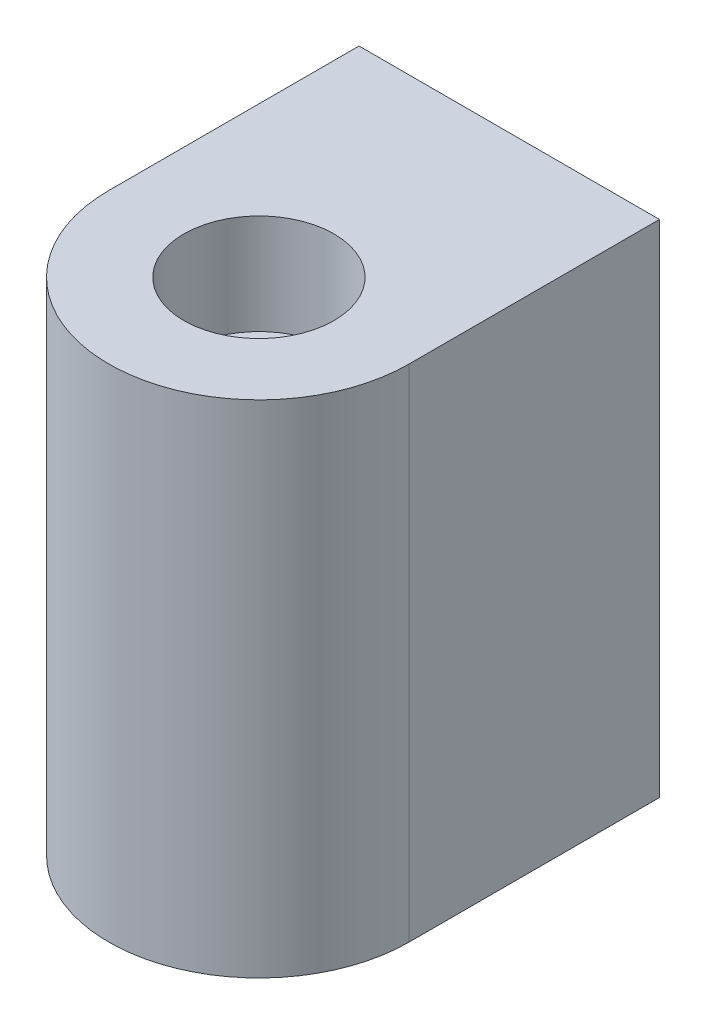
ISO-10303-21;
HEADER;
FILE_DESCRIPTION(('STEP AP214'),'2;1');
FILE_NAME('part.step','',(''),(''),'','','');
FILE_SCHEMA(('AUTOMOTIVE_DESIGN { 1 0 10303 214 1 1 1 1 }'));
ENDSEC;
DATA;
#1=APPLICATION_CONTEXT('core data for automotive mechanical design processes');
#2=APPLICATION_PROTOCOL_DEFINITION('international standard','automotive_design',2000,#1);
#3=PRODUCT_CONTEXT('',#1,'mechanical');
#4=PRODUCT('Part','Part','',(#3));
#5=PRODUCT_RELATED_PRODUCT_CATEGORY('part','',(#4));
#6=PRODUCT_DEFINITION_FORMATION('','',#4);
#7=PRODUCT_DEFINITION_CONTEXT('part definition',#1,'design');
#8=PRODUCT_DEFINITION('design','',#6,#7);
#9=PRODUCT_DEFINITION_SHAPE('','',#8);
#10=(LENGTH_UNIT() NAMED_UNIT(*) SI_UNIT(.MILLI.,.METRE.));
#11=(NAMED_UNIT(*) PLANE_ANGLE_UNIT() SI_UNIT($,.RADIAN.));
#12=(NAMED_UNIT(*) SI_UNIT($,.STERADIAN.) SOLID_ANGLE_UNIT());
#13=UNCERTAINTY_MEASURE_WITH_UNIT(LENGTH_MEASURE(1.E-05),#10,'distance_accuracy_value','');
#14=(GEOMETRIC_REPRESENTATION_CONTEXT(3) GLOBAL_UNCERTAINTY_ASSIGNED_CONTEXT((#13)) GLOBAL_UNIT_ASSIGNED_CONTEXT((#10,
#11,#12)) REPRESENTATION_CONTEXT('',''));
#15=CARTESIAN_POINT('',(0.,0.,0.));
#16=DIRECTION('',(0.,0.,1.));
#17=DIRECTION('',(1.,0.,0.));
#18=AXIS2_PLACEMENT_3D('',#15,#16,#17);
#19=CARTESIAN_POINT('',(0.,5.,5.));
#20=DIRECTION('',(0.,1.,0.));
#21=DIRECTION('',(-1.,0.,0.));
#22=AXIS2_PLACEMENT_3D('',#19,#20,#21);
#23=CYLINDRICAL_SURFACE('',#22,3.);
#24=DIRECTION('',(0.,-1.,0.));
#25=VECTOR('',#24,1.);
#26=CARTESIAN_POINT('',(3.,5.,5.));
#27=LINE('',#26,#25);
#28=CARTESIAN_POINT('',(3.,5.,5.));
#29=VERTEX_POINT('',#28);
#30=CARTESIAN_POINT('',(3.,-5.,5.));
#31=VERTEX_POINT('',#30);
#32=EDGE_CURVE('E82',#29,#31,#27,.T.);
#33=ORIENTED_EDGE('',*,*,#32,.F.);
#34=CARTESIAN_POINT('',(0.,5.,5.));
#35=DIRECTION('',(0.,-1.,0.));
#36=DIRECTION('',(0.,0.,-1.));
#37=AXIS2_PLACEMENT_3D('',#34,#35,#36);
#38=CIRCLE('',#37,3.);
#39=CARTESIAN_POINT('',(-3.,5.,5.));
#40=VERTEX_POINT('',#39);
#41=EDGE_CURVE('E43',#40,#29,#38,.F.);
#42=ORIENTED_EDGE('',*,*,#41,.F.);
#43=DIRECTION('',(0.,-1.,0.));
#44=VECTOR('',#43,1.);
#45=CARTESIAN_POINT('',(-3.,5.,5.));
#46=LINE('',#45,#44);
#47=CARTESIAN_POINT('',(-3.,-5.,5.));
#48=VERTEX_POINT('',#47);
#49=EDGE_CURVE('E111',#48,#40,#46,.F.);
#50=ORIENTED_EDGE('',*,*,#49,.F.);
#51=CARTESIAN_POINT('',(0.,-5.,5.));
#52=DIRECTION('',(0.,1.,0.));
#53=DIRECTION('',(0.,0.,1.));
#54=AXIS2_PLACEMENT_3D('',#51,#52,#53);
#55=CIRCLE('',#54,3.);
#56=EDGE_CURVE('E11',#31,#48,#55,.F.);
#57=ORIENTED_EDGE('',*,*,#56,.F.);
#58=EDGE_LOOP('',(#33,#42,#50,#57));
#59=FACE_BOUND('',#58,.T.);
#60=ADVANCED_FACE('F35',(#59),#23,.T.);
#61=CARTESIAN_POINT('',(3.,5.,8.));
#62=DIRECTION('',(-1.,0.,0.));
#63=DIRECTION('',(0.,-1.,0.));
#64=AXIS2_PLACEMENT_3D('',#61,#62,#63);
#65=PLANE('',#64);
#66=DIRECTION('',(0.,0.,-1.));
#67=VECTOR('',#66,1.);
#68=CARTESIAN_POINT('',(3.,5.,8.));
#69=LINE('',#68,#67);
#70=CARTESIAN_POINT('',(3.,5.,0.));
#71=VERTEX_POINT('',#70);
#72=EDGE_CURVE('E73',#29,#71,#69,.T.);
#73=ORIENTED_EDGE('',*,*,#72,.F.);
#74=ORIENTED_EDGE('',*,*,#32,.T.);
#75=DIRECTION('',(0.,0.,-1.));
#76=VECTOR('',#75,1.);
#77=CARTESIAN_POINT('',(3.,-5.,8.));
#78=LINE('',#77,#76);
#79=CARTESIAN_POINT('',(3.,-5.,0.));
#80=VERTEX_POINT('',#79);
#81=EDGE_CURVE('E94',#31,#80,#78,.T.);
#82=ORIENTED_EDGE('',*,*,#81,.T.);
#83=DIRECTION('',(0.,1.,0.));
#84=VECTOR('',#83,1.);
#85=CARTESIAN_POINT('',(3.,5.,0.));
#86=LINE('',#85,#84);
#87=EDGE_CURVE('E89',#80,#71,#86,.T.);
#88=ORIENTED_EDGE('',*,*,#87,.T.);
#89=EDGE_LOOP('',(#73,#74,#82,#88));
#90=FACE_BOUND('',#89,.T.);
#91=ADVANCED_FACE('F93',(#90),#65,.F.);
#92=CARTESIAN_POINT('',(-3.,5.,8.));
#93=DIRECTION('',(0.,-1.,0.));
#94=DIRECTION('',(0.,0.,-1.));
#95=AXIS2_PLACEMENT_3D('',#92,#93,#94);
#96=PLANE('',#95);
#97=CARTESIAN_POINT('',(0.,5.,5.));
#98=DIRECTION('',(0.,1.,0.));
#99=DIRECTION('',(0.,0.,1.));
#100=AXIS2_PLACEMENT_3D('',#97,#98,#99);
#101=CIRCLE('',#100,1.5);
#102=CARTESIAN_POINT('',(0.,5.,6.5));
#103=VERTEX_POINT('',#102);
#104=EDGE_CURVE('E99',#103,#103,#101,.T.);
#105=ORIENTED_EDGE('',*,*,#104,.F.);
#106=EDGE_LOOP('',(#105));
#107=FACE_BOUND('',#106,.T.);
#108=DIRECTION('',(0.,0.,-1.));
#109=VECTOR('',#108,1.);
#110=CARTESIAN_POINT('',(-3.,5.,8.));
#111=LINE('',#110,#109);
#112=CARTESIAN_POINT('',(-3.,5.,0.));
#113=VERTEX_POINT('',#112);
#114=EDGE_CURVE('E83',#40,#113,#111,.T.);
#115=ORIENTED_EDGE('',*,*,#114,.F.);
#116=ORIENTED_EDGE('',*,*,#41,.T.);
#117=ORIENTED_EDGE('',*,*,#72,.T.);
#118=DIRECTION('',(-1.,0.,0.));
#119=VECTOR('',#118,1.);
#120=CARTESIAN_POINT('',(-3.,5.,0.));
#121=LINE('',#120,#119);
#122=EDGE_CURVE('E77',#71,#113,#121,.T.);
#123=ORIENTED_EDGE('',*,*,#122,.T.);
#124=EDGE_LOOP('',(#115,#116,#117,#123));
#125=FACE_BOUND('',#124,.T.);
#126=ADVANCED_FACE('F76',(#107,#125),#96,.F.);
#127=CARTESIAN_POINT('',(-3.,5.,8.));
#128=DIRECTION('',(1.,0.,0.));
#129=DIRECTION('',(0.,1.,0.));
#130=AXIS2_PLACEMENT_3D('',#127,#128,#129);
#131=PLANE('',#130);
#132=DIRECTION('',(0.,0.,-1.));
#133=VECTOR('',#132,1.);
#134=CARTESIAN_POINT('',(-3.,-5.,8.));
#135=LINE('',#134,#133);
#136=CARTESIAN_POINT('',(-3.,-5.,0.));
#137=VERTEX_POINT('',#136);
#138=EDGE_CURVE('E107',#48,#137,#135,.T.);
#139=ORIENTED_EDGE('',*,*,#138,.F.);
#140=ORIENTED_EDGE('',*,*,#49,.T.);
#141=ORIENTED_EDGE('',*,*,#114,.T.);
#142=DIRECTION('',(0.,-1.,0.));
#143=VECTOR('',#142,1.);
#144=CARTESIAN_POINT('',(-3.,5.,0.));
#145=LINE('',#144,#143);
#146=EDGE_CURVE('E91',#113,#137,#145,.T.);
#147=ORIENTED_EDGE('',*,*,#146,.T.);
#148=EDGE_LOOP('',(#139,#140,#141,#147));
#149=FACE_BOUND('',#148,.T.);
#150=ADVANCED_FACE('F114',(#149),#131,.F.);
#151=CARTESIAN_POINT('',(-3.,-5.,8.));
#152=DIRECTION('',(0.,1.,0.));
#153=DIRECTION('',(0.,0.,1.));
#154=AXIS2_PLACEMENT_3D('',#151,#152,#153);
#155=PLANE('',#154);
#156=ORIENTED_EDGE('',*,*,#81,.F.);
#157=ORIENTED_EDGE('',*,*,#56,.T.);
#158=ORIENTED_EDGE('',*,*,#138,.T.);
#159=DIRECTION('',(1.,0.,0.));
#160=VECTOR('',#159,1.);
#161=CARTESIAN_POINT('',(-3.,-5.,0.));
#162=LINE('',#161,#160);
#163=EDGE_CURVE('E104',#137,#80,#162,.T.);
#164=ORIENTED_EDGE('',*,*,#163,.T.);
#165=EDGE_LOOP('',(#156,#157,#158,#164));
#166=FACE_BOUND('',#165,.T.);
#167=ADVANCED_FACE('F115',(#166),#155,.F.);
#168=CARTESIAN_POINT('',(0.,0.,0.));
#169=DIRECTION('',(0.,0.,1.));
#170=DIRECTION('',(1.,0.,0.));
#171=AXIS2_PLACEMENT_3D('',#168,#169,#170);
#172=PLANE('',#171);
#173=ORIENTED_EDGE('',*,*,#87,.F.);
#174=ORIENTED_EDGE('',*,*,#163,.F.);
#175=ORIENTED_EDGE('',*,*,#146,.F.);
#176=ORIENTED_EDGE('',*,*,#122,.F.);
#177=EDGE_LOOP('',(#173,#174,#175,#176));
#178=FACE_BOUND('',#177,.T.);
#179=ADVANCED_FACE('F87',(#178),#172,.F.);
#180=CARTESIAN_POINT('',(0.,3.,5.));
#181=DIRECTION('',(0.,1.,0.));
#182=DIRECTION('',(0.,0.,1.));
#183=AXIS2_PLACEMENT_3D('',#180,#181,#182);
#184=CYLINDRICAL_SURFACE('',#183,1.5);
#185=CARTESIAN_POINT('',(0.,3.,5.));
#186=DIRECTION('',(0.,1.,0.));
#187=DIRECTION('',(0.,0.,1.));
#188=AXIS2_PLACEMENT_3D('',#185,#186,#187);
#189=CIRCLE('',#188,1.5);
#190=CARTESIAN_POINT('',(0.,3.,6.5));
#191=VERTEX_POINT('',#190);
#192=EDGE_CURVE('E96',#191,#191,#189,.T.);
#193=ORIENTED_EDGE('',*,*,#192,.F.);
#194=EDGE_LOOP('',(#193));
#195=FACE_BOUND('',#194,.T.);
#196=ORIENTED_EDGE('',*,*,#104,.T.);
#197=EDGE_LOOP('',(#196));
#198=FACE_BOUND('',#197,.T.);
#199=ADVANCED_FACE('F122',(#195,#198),#184,.F.);
#200=CARTESIAN_POINT('',(0.,3.,5.));
#201=DIRECTION('',(0.,1.,0.));
#202=DIRECTION('',(0.,0.,1.));
#203=AXIS2_PLACEMENT_3D('',#200,#201,#202);
#204=PLANE('',#203);
#205=ORIENTED_EDGE('',*,*,#192,.T.);
#206=EDGE_LOOP('',(#205));
#207=FACE_BOUND('',#206,.T.);
#208=ADVANCED_FACE('F140',(#207),#204,.T.);
#209=CLOSED_SHELL('',(#60,#91,#126,#150,#167,#179,#199,#208));
#210=MANIFOLD_SOLID_BREP('B2',#209);
#211=ADVANCED_BREP_SHAPE_REPRESENTATION('',(#18,#210),#14);
#212=SHAPE_DEFINITION_REPRESENTATION(#9,#211);
ENDSEC;
END-ISO-10303-21;
